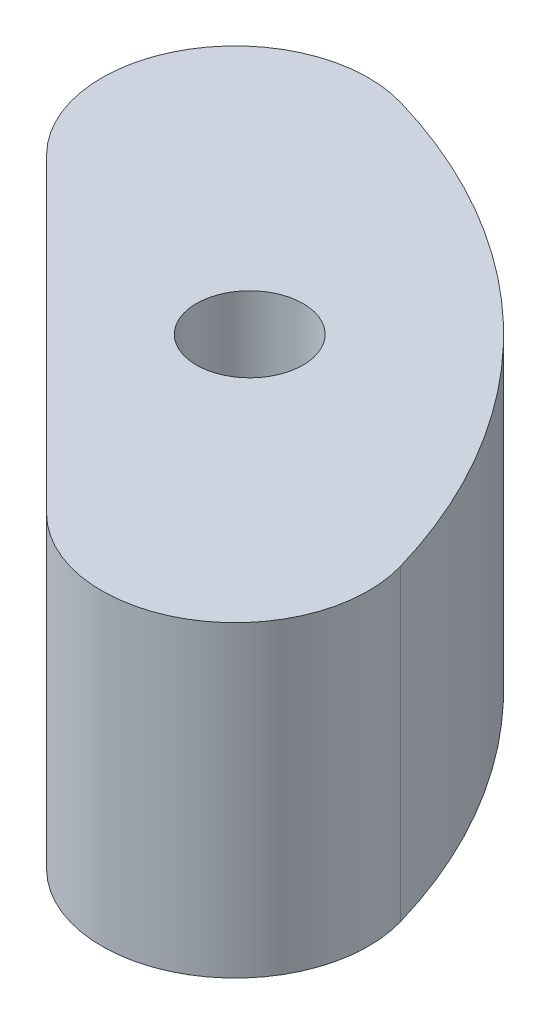
ISO-10303-21;
HEADER;
FILE_DESCRIPTION(('STEP AP214'),'2;1');
FILE_NAME('part.step','',(''),(''),'','','');
FILE_SCHEMA(('AUTOMOTIVE_DESIGN { 1 0 10303 214 1 1 1 1 }'));
ENDSEC;
DATA;
#1=APPLICATION_CONTEXT('core data for automotive mechanical design processes');
#2=APPLICATION_PROTOCOL_DEFINITION('international standard','automotive_design',2000,#1);
#3=PRODUCT_CONTEXT('',#1,'mechanical');
#4=PRODUCT('Part','Part','',(#3));
#5=PRODUCT_RELATED_PRODUCT_CATEGORY('part','',(#4));
#6=PRODUCT_DEFINITION_FORMATION('','',#4);
#7=PRODUCT_DEFINITION_CONTEXT('part definition',#1,'design');
#8=PRODUCT_DEFINITION('design','',#6,#7);
#9=PRODUCT_DEFINITION_SHAPE('','',#8);
#10=(LENGTH_UNIT() NAMED_UNIT(*) SI_UNIT(.MILLI.,.METRE.));
#11=(NAMED_UNIT(*) PLANE_ANGLE_UNIT() SI_UNIT($,.RADIAN.));
#12=(NAMED_UNIT(*) SI_UNIT($,.STERADIAN.) SOLID_ANGLE_UNIT());
#13=UNCERTAINTY_MEASURE_WITH_UNIT(LENGTH_MEASURE(1.E-05),#10,'distance_accuracy_value','');
#14=(GEOMETRIC_REPRESENTATION_CONTEXT(3) GLOBAL_UNCERTAINTY_ASSIGNED_CONTEXT((#13)) GLOBAL_UNIT_ASSIGNED_CONTEXT((#10,
#11,#12)) REPRESENTATION_CONTEXT('',''));
#15=CARTESIAN_POINT('',(0.,0.,0.));
#16=DIRECTION('',(0.,0.,1.));
#17=DIRECTION('',(1.,0.,0.));
#18=AXIS2_PLACEMENT_3D('',#15,#16,#17);
#19=CARTESIAN_POINT('',(0.,9.525,0.));
#20=DIRECTION('',(0.,1.,0.));
#21=DIRECTION('',(0.,0.,1.));
#22=AXIS2_PLACEMENT_3D('',#19,#20,#21);
#23=PLANE('',#22);
#24=DIRECTION('',(0.707106781186548,0.,0.707106781186547));
#25=VECTOR('',#24,1.);
#26=CARTESIAN_POINT('',(-11.3537211967283,9.525,-34.7023871115081));
#27=LINE('',#26,#25);
#28=CARTESIAN_POINT('',(2.05193509485064,9.525,-21.2967308199291));
#29=VERTEX_POINT('',#28);
#30=CARTESIAN_POINT('',(21.2967308199291,9.525,-2.05193509485065));
#31=VERTEX_POINT('',#30);
#32=EDGE_CURVE('E121',#29,#31,#27,.T.);
#33=ORIENTED_EDGE('',*,*,#32,.T.);
#34=CARTESIAN_POINT('',(27.1338972986241,9.525,-7.8891015735456));
#35=DIRECTION('',(0.,1.,0.));
#36=DIRECTION('',(0.,0.,1.));
#37=AXIS2_PLACEMENT_3D('',#34,#35,#36);
#38=CIRCLE('',#37,8.255);
#39=CARTESIAN_POINT('',(35.0606538128289,9.525,-10.1937829321095));
#40=VERTEX_POINT('',#39);
#41=EDGE_CURVE('E11',#31,#40,#38,.T.);
#42=ORIENTED_EDGE('',*,*,#41,.T.);
#43=CARTESIAN_POINT('',(0.,9.525,0.));
#44=DIRECTION('',(0.,1.,0.));
#45=DIRECTION('',(0.,0.,1.));
#46=AXIS2_PLACEMENT_3D('',#43,#44,#45);
#47=CIRCLE('',#46,36.5125);
#48=CARTESIAN_POINT('',(10.1937829321095,9.525,-35.0606538128289));
#49=VERTEX_POINT('',#48);
#50=EDGE_CURVE('E102',#40,#49,#47,.T.);
#51=ORIENTED_EDGE('',*,*,#50,.T.);
#52=CARTESIAN_POINT('',(7.88910157354559,9.525,-27.1338972986241));
#53=DIRECTION('',(0.,1.,0.));
#54=DIRECTION('',(0.,0.,1.));
#55=AXIS2_PLACEMENT_3D('',#52,#53,#54);
#56=CIRCLE('',#55,8.255);
#57=EDGE_CURVE('E52',#49,#29,#56,.T.);
#58=ORIENTED_EDGE('',*,*,#57,.T.);
#59=EDGE_LOOP('',(#33,#42,#51,#58));
#60=FACE_BOUND('',#59,.T.);
#61=CARTESIAN_POINT('',(17.9605122421383,9.525,-17.9605122421383));
#62=DIRECTION('',(0.,1.,0.));
#63=DIRECTION('',(0.,0.,1.));
#64=AXIS2_PLACEMENT_3D('',#61,#62,#63);
#65=CIRCLE('',#64,3.302);
#66=CARTESIAN_POINT('',(17.9605122421383,9.525,-21.2625122421383));
#67=VERTEX_POINT('',#66);
#68=EDGE_CURVE('E110',#67,#67,#65,.T.);
#69=ORIENTED_EDGE('',*,*,#68,.F.);
#70=EDGE_LOOP('',(#69));
#71=FACE_BOUND('',#70,.T.);
#72=ADVANCED_FACE('F43',(#60,#71),#23,.T.);
#73=CARTESIAN_POINT('',(0.,-9.525,0.));
#74=DIRECTION('',(0.,1.,0.));
#75=DIRECTION('',(0.,0.,1.));
#76=AXIS2_PLACEMENT_3D('',#73,#74,#75);
#77=PLANE('',#76);
#78=CARTESIAN_POINT('',(0.,-9.525,0.));
#79=DIRECTION('',(0.,1.,0.));
#80=DIRECTION('',(0.,0.,1.));
#81=AXIS2_PLACEMENT_3D('',#78,#79,#80);
#82=CIRCLE('',#81,36.5125);
#83=CARTESIAN_POINT('',(35.0606538128289,-9.525,-10.1937829321095));
#84=VERTEX_POINT('',#83);
#85=CARTESIAN_POINT('',(10.1937829321095,-9.525,-35.0606538128289));
#86=VERTEX_POINT('',#85);
#87=EDGE_CURVE('E100',#84,#86,#82,.T.);
#88=ORIENTED_EDGE('',*,*,#87,.F.);
#89=CARTESIAN_POINT('',(27.1338972986241,-9.525,-7.8891015735456));
#90=DIRECTION('',(0.,1.,0.));
#91=DIRECTION('',(0.,0.,1.));
#92=AXIS2_PLACEMENT_3D('',#89,#90,#91);
#93=CIRCLE('',#92,8.255);
#94=CARTESIAN_POINT('',(21.2967308199291,-9.525,-2.05193509485065));
#95=VERTEX_POINT('',#94);
#96=EDGE_CURVE('E84',#84,#95,#93,.F.);
#97=ORIENTED_EDGE('',*,*,#96,.T.);
#98=DIRECTION('',(0.707106781186548,0.,0.707106781186547));
#99=VECTOR('',#98,1.);
#100=CARTESIAN_POINT('',(-11.3537211967283,-9.525,-34.7023871115081));
#101=LINE('',#100,#99);
#102=CARTESIAN_POINT('',(2.05193509485064,-9.525,-21.2967308199291));
#103=VERTEX_POINT('',#102);
#104=EDGE_CURVE('E109',#103,#95,#101,.T.);
#105=ORIENTED_EDGE('',*,*,#104,.F.);
#106=CARTESIAN_POINT('',(7.88910157354559,-9.525,-27.1338972986241));
#107=DIRECTION('',(0.,1.,0.));
#108=DIRECTION('',(0.,0.,1.));
#109=AXIS2_PLACEMENT_3D('',#106,#107,#108);
#110=CIRCLE('',#109,8.255);
#111=EDGE_CURVE('E94',#103,#86,#110,.F.);
#112=ORIENTED_EDGE('',*,*,#111,.T.);
#113=EDGE_LOOP('',(#88,#97,#105,#112));
#114=FACE_BOUND('',#113,.T.);
#115=CARTESIAN_POINT('',(17.9605122421383,-9.525,-17.9605122421383));
#116=DIRECTION('',(0.,1.,0.));
#117=DIRECTION('',(0.,0.,1.));
#118=AXIS2_PLACEMENT_3D('',#115,#116,#117);
#119=CIRCLE('',#118,3.302);
#120=CARTESIAN_POINT('',(17.9605122421383,-9.525,-21.2625122421383));
#121=VERTEX_POINT('',#120);
#122=EDGE_CURVE('E118',#121,#121,#119,.T.);
#123=ORIENTED_EDGE('',*,*,#122,.T.);
#124=EDGE_LOOP('',(#123));
#125=FACE_BOUND('',#124,.T.);
#126=ADVANCED_FACE('F106',(#114,#125),#77,.F.);
#127=CARTESIAN_POINT('',(0.,9.525,0.));
#128=DIRECTION('',(0.,-1.,0.));
#129=DIRECTION('',(0.,0.,-1.));
#130=AXIS2_PLACEMENT_3D('',#127,#128,#129);
#131=CYLINDRICAL_SURFACE('',#130,36.5125);
#132=ORIENTED_EDGE('',*,*,#50,.F.);
#133=DIRECTION('',(0.,-1.,0.));
#134=VECTOR('',#133,1.);
#135=CARTESIAN_POINT('',(35.0606538128289,9.525,-10.1937829321095));
#136=LINE('',#135,#134);
#137=EDGE_CURVE('E88',#40,#84,#136,.T.);
#138=ORIENTED_EDGE('',*,*,#137,.T.);
#139=ORIENTED_EDGE('',*,*,#87,.T.);
#140=DIRECTION('',(0.,-1.,0.));
#141=VECTOR('',#140,1.);
#142=CARTESIAN_POINT('',(10.1937829321095,9.525,-35.0606538128289));
#143=LINE('',#142,#141);
#144=EDGE_CURVE('E104',#86,#49,#143,.F.);
#145=ORIENTED_EDGE('',*,*,#144,.T.);
#146=EDGE_LOOP('',(#132,#138,#139,#145));
#147=FACE_BOUND('',#146,.T.);
#148=ADVANCED_FACE('F99',(#147),#131,.T.);
#149=CARTESIAN_POINT('',(-11.3537211967283,9.525,-34.7023871115081));
#150=DIRECTION('',(0.707106781186547,0.,-0.707106781186548));
#151=DIRECTION('',(-0.707106781186548,0.,-0.707106781186547));
#152=AXIS2_PLACEMENT_3D('',#149,#150,#151);
#153=PLANE('',#152);
#154=CARTESIAN_POINT('',(18.7241875651127,-6.249999946,-4.62447834966712));
#155=DIRECTION('',(-0.707106781186547,0.,0.707106781186548));
#156=DIRECTION('',(0.707106781186548,0.,0.707106781186547));
#157=AXIS2_PLACEMENT_3D('',#154,#155,#156);
#158=CIRCLE('',#157,1.950000037);
#159=CARTESIAN_POINT('',(20.1030458145894,-6.249999946,-3.2456201001904));
#160=VERTEX_POINT('',#159);
#161=EDGE_CURVE('E151',#160,#160,#158,.T.);
#162=ORIENTED_EDGE('',*,*,#161,.F.);
#163=EDGE_LOOP('',(#162));
#164=FACE_BOUND('',#163,.T.);
#165=CARTESIAN_POINT('',(4.62447834966712,-6.249999946,-18.7241875651127));
#166=DIRECTION('',(-0.707106781186547,0.,0.707106781186548));
#167=DIRECTION('',(0.707106781186548,0.,0.707106781186547));
#168=AXIS2_PLACEMENT_3D('',#165,#166,#167);
#169=CIRCLE('',#168,1.950000037);
#170=CARTESIAN_POINT('',(6.00333659914384,-6.249999946,-17.3453293156359));
#171=VERTEX_POINT('',#170);
#172=EDGE_CURVE('E159',#171,#171,#169,.T.);
#173=ORIENTED_EDGE('',*,*,#172,.F.);
#174=EDGE_LOOP('',(#173));
#175=FACE_BOUND('',#174,.T.);
#176=CARTESIAN_POINT('',(4.62447834966712,6.249999946,-18.7241875651127));
#177=DIRECTION('',(-0.707106781186547,0.,0.707106781186548));
#178=DIRECTION('',(0.707106781186548,0.,0.707106781186547));
#179=AXIS2_PLACEMENT_3D('',#176,#177,#178);
#180=CIRCLE('',#179,1.950000037);
#181=CARTESIAN_POINT('',(6.00333659914384,6.249999946,-17.3453293156359));
#182=VERTEX_POINT('',#181);
#183=EDGE_CURVE('E143',#182,#182,#180,.T.);
#184=ORIENTED_EDGE('',*,*,#183,.F.);
#185=EDGE_LOOP('',(#184));
#186=FACE_BOUND('',#185,.T.);
#187=CARTESIAN_POINT('',(18.7241875651127,6.249999946,-4.62447834966712));
#188=DIRECTION('',(-0.707106781186547,0.,0.707106781186548));
#189=DIRECTION('',(0.707106781186548,0.,0.707106781186547));
#190=AXIS2_PLACEMENT_3D('',#187,#188,#189);
#191=CIRCLE('',#190,1.950000037);
#192=CARTESIAN_POINT('',(20.1030458145894,6.249999946,-3.24562010019041));
#193=VERTEX_POINT('',#192);
#194=EDGE_CURVE('E139',#193,#193,#191,.T.);
#195=ORIENTED_EDGE('',*,*,#194,.F.);
#196=EDGE_LOOP('',(#195));
#197=FACE_BOUND('',#196,.T.);
#198=ORIENTED_EDGE('',*,*,#104,.T.);
#199=DIRECTION('',(0.,-1.,0.));
#200=VECTOR('',#199,1.);
#201=CARTESIAN_POINT('',(21.2967308199291,9.525,-2.05193509485065));
#202=LINE('',#201,#200);
#203=EDGE_CURVE('E59',#95,#31,#202,.F.);
#204=ORIENTED_EDGE('',*,*,#203,.T.);
#205=ORIENTED_EDGE('',*,*,#32,.F.);
#206=DIRECTION('',(0.,-1.,0.));
#207=VECTOR('',#206,1.);
#208=CARTESIAN_POINT('',(2.05193509485064,9.525,-21.2967308199291));
#209=LINE('',#208,#207);
#210=EDGE_CURVE('E93',#29,#103,#209,.T.);
#211=ORIENTED_EDGE('',*,*,#210,.T.);
#212=EDGE_LOOP('',(#198,#204,#205,#211));
#213=FACE_BOUND('',#212,.T.);
#214=ADVANCED_FACE('F172',(#164,#175,#186,#197,#213),#153,.F.);
#215=CARTESIAN_POINT('',(17.9605122421383,9.525,-17.9605122421383));
#216=DIRECTION('',(0.,-1.,0.));
#217=DIRECTION('',(0.,0.,-1.));
#218=AXIS2_PLACEMENT_3D('',#215,#216,#217);
#219=CYLINDRICAL_SURFACE('',#218,3.302);
#220=CARTESIAN_POINT('',(17.9605122421383,9.525,-21.2625122421383));
#221=CARTESIAN_POINT('',(17.9605122421383,9.3265625,-21.2625122421383));
#222=CARTESIAN_POINT('',(17.9605122421383,9.128125,-21.2625122421383));
#223=CARTESIAN_POINT('',(17.9605122421383,8.73125,-21.2625122421383));
#224=CARTESIAN_POINT('',(17.9605122421383,8.5328125,-21.2625122421383));
#225=CARTESIAN_POINT('',(17.9605122421383,8.1359375,-21.2625122421383));
#226=CARTESIAN_POINT('',(17.9605122421383,7.9375,-21.2625122421383));
#227=CARTESIAN_POINT('',(17.9605122421383,7.540625,-21.2625122421383));
#228=CARTESIAN_POINT('',(17.9605122421383,7.3421875,-21.2625122421383));
#229=CARTESIAN_POINT('',(17.9605122421383,6.9453125,-21.2625122421383));
#230=CARTESIAN_POINT('',(17.9605122421383,6.746875,-21.2625122421383));
#231=CARTESIAN_POINT('',(17.9605122421383,6.35,-21.2625122421383));
#232=CARTESIAN_POINT('',(17.9605122421383,6.1515625,-21.2625122421383));
#233=CARTESIAN_POINT('',(17.9605122421383,5.7546875,-21.2625122421383));
#234=CARTESIAN_POINT('',(17.9605122421383,5.55625,-21.2625122421383));
#235=CARTESIAN_POINT('',(17.9605122421383,5.159375,-21.2625122421383));
#236=CARTESIAN_POINT('',(17.9605122421383,4.9609375,-21.2625122421383));
#237=CARTESIAN_POINT('',(17.9605122421383,4.5640625,-21.2625122421383));
#238=CARTESIAN_POINT('',(17.9605122421383,4.365625,-21.2625122421383));
#239=CARTESIAN_POINT('',(17.9605122421383,3.96875,-21.2625122421383));
#240=CARTESIAN_POINT('',(17.9605122421383,3.7703125,-21.2625122421383));
#241=CARTESIAN_POINT('',(17.9605122421383,3.3734375,-21.2625122421383));
#242=CARTESIAN_POINT('',(17.9605122421383,3.175,-21.2625122421383));
#243=CARTESIAN_POINT('',(17.9605122421383,2.778125,-21.2625122421383));
#244=CARTESIAN_POINT('',(17.9605122421383,2.5796875,-21.2625122421383));
#245=CARTESIAN_POINT('',(17.9605122421383,2.1828125,-21.2625122421383));
#246=CARTESIAN_POINT('',(17.9605122421383,1.984375,-21.2625122421383));
#247=CARTESIAN_POINT('',(17.9605122421383,1.5875,-21.2625122421383));
#248=CARTESIAN_POINT('',(17.9605122421383,1.3890625,-21.2625122421383));
#249=CARTESIAN_POINT('',(17.9605122421383,0.992187500000001,-21.2625122421383));
#250=CARTESIAN_POINT('',(17.9605122421383,0.793750000000001,-21.2625122421383));
#251=CARTESIAN_POINT('',(17.9605122421383,0.396875,-21.2625122421383));
#252=CARTESIAN_POINT('',(17.9605122421383,0.1984375,-21.2625122421383));
#253=CARTESIAN_POINT('',(17.9605122421383,-0.1984375,-21.2625122421383));
#254=CARTESIAN_POINT('',(17.9605122421383,-0.396875,-21.2625122421383));
#255=CARTESIAN_POINT('',(17.9605122421383,-0.793750000000001,-21.2625122421383));
#256=CARTESIAN_POINT('',(17.9605122421383,-0.992187500000001,-21.2625122421383));
#257=CARTESIAN_POINT('',(17.9605122421383,-1.3890625,-21.2625122421383));
#258=CARTESIAN_POINT('',(17.9605122421383,-1.5875,-21.2625122421383));
#259=CARTESIAN_POINT('',(17.9605122421383,-1.984375,-21.2625122421383));
#260=CARTESIAN_POINT('',(17.9605122421383,-2.1828125,-21.2625122421383));
#261=CARTESIAN_POINT('',(17.9605122421383,-2.5796875,-21.2625122421383));
#262=CARTESIAN_POINT('',(17.9605122421383,-2.778125,-21.2625122421383));
#263=CARTESIAN_POINT('',(17.9605122421383,-3.175,-21.2625122421383));
#264=CARTESIAN_POINT('',(17.9605122421383,-3.3734375,-21.2625122421383));
#265=CARTESIAN_POINT('',(17.9605122421383,-3.7703125,-21.2625122421383));
#266=CARTESIAN_POINT('',(17.9605122421383,-3.96875,-21.2625122421383));
#267=CARTESIAN_POINT('',(17.9605122421383,-4.365625,-21.2625122421383));
#268=CARTESIAN_POINT('',(17.9605122421383,-4.5640625,-21.2625122421383));
#269=CARTESIAN_POINT('',(17.9605122421383,-4.9609375,-21.2625122421383));
#270=CARTESIAN_POINT('',(17.9605122421383,-5.159375,-21.2625122421383));
#271=CARTESIAN_POINT('',(17.9605122421383,-5.55625,-21.2625122421383));
#272=CARTESIAN_POINT('',(17.9605122421383,-5.7546875,-21.2625122421383));
#273=CARTESIAN_POINT('',(17.9605122421383,-6.1515625,-21.2625122421383));
#274=CARTESIAN_POINT('',(17.9605122421383,-6.35,-21.2625122421383));
#275=CARTESIAN_POINT('',(17.9605122421383,-6.746875,-21.2625122421383));
#276=CARTESIAN_POINT('',(17.9605122421383,-6.9453125,-21.2625122421383));
#277=CARTESIAN_POINT('',(17.9605122421383,-7.3421875,-21.2625122421383));
#278=CARTESIAN_POINT('',(17.9605122421383,-7.540625,-21.2625122421383));
#279=CARTESIAN_POINT('',(17.9605122421383,-7.9375,-21.2625122421383));
#280=CARTESIAN_POINT('',(17.9605122421383,-8.1359375,-21.2625122421383));
#281=CARTESIAN_POINT('',(17.9605122421383,-8.5328125,-21.2625122421383));
#282=CARTESIAN_POINT('',(17.9605122421383,-8.73125,-21.2625122421383));
#283=CARTESIAN_POINT('',(17.9605122421383,-9.128125,-21.2625122421383));
#284=CARTESIAN_POINT('',(17.9605122421383,-9.3265625,-21.2625122421383));
#285=CARTESIAN_POINT('',(17.9605122421383,-9.525,-21.2625122421383));
#286=B_SPLINE_CURVE_WITH_KNOTS('',3,(#220,#221,#222,#223,#224,#225,#226,#227,#228,#229,#230,
#231,#232,#233,#234,#235,#236,#237,#238,#239,#240,#241,#242,#243,#244,#245,#246,#247,#248,#249,
#250,#251,#252,#253,#254,#255,#256,#257,#258,#259,#260,#261,#262,#263,#264,#265,#266,#267,#268,
#269,#270,#271,#272,#273,#274,#275,#276,#277,#278,#279,#280,#281,#282,#283,#284,#285),
.UNSPECIFIED.,.F.,.F.,(4,2,2,2,2,2,2,2,2,2,2,2,2,2,2,2,2,2,2,2,2,2,2,2,2,2,2,2,2,2,2,2,4),(0.,
0.5953125,1.190625,1.7859375,2.38125,2.9765625,3.571875,4.1671875,4.7625,5.3578125,5.953125,
6.5484375,7.14375,7.7390625,8.334375,8.9296875,9.525,10.1203125,10.715625,11.3109375,11.90625,
12.5015625,13.096875,13.6921875,14.2875,14.8828125,15.478125,16.0734375,16.66875,17.2640625,
17.859375,18.4546875,19.05),.UNSPECIFIED.);
#287=EDGE_CURVE('BSEAM175',#67,#121,#286,.T.);
#288=ORIENTED_EDGE('',*,*,#68,.T.);
#289=ORIENTED_EDGE('',*,*,#122,.F.);
#290=ORIENTED_EDGE('',*,*,#287,.T.);
#291=ORIENTED_EDGE('',*,*,#287,.F.);
#292=EDGE_LOOP('',(#288,#290,#289,#291));
#293=FACE_BOUND('',#292,.T.);
#294=ADVANCED_FACE('F175',(#293),#219,.F.);
#295=CARTESIAN_POINT('',(22.8254069553916,6.249999946,-8.72569773994607));
#296=DIRECTION('',(-0.707106781186547,0.,0.707106781186548));
#297=DIRECTION('',(0.707106781186548,0.,0.707106781186547));
#298=AXIS2_PLACEMENT_3D('',#295,#296,#297);
#299=CYLINDRICAL_SURFACE('',#298,1.950000037);
#300=CARTESIAN_POINT('',(22.8254069553916,6.249999946,-8.72569773994607));
#301=DIRECTION('',(-0.707106781186547,0.,0.707106781186548));
#302=DIRECTION('',(0.707106781186548,0.,0.707106781186547));
#303=AXIS2_PLACEMENT_3D('',#300,#301,#302);
#304=CIRCLE('',#303,1.950000037);
#305=CARTESIAN_POINT('',(24.2042652048683,6.249999946,-7.34683949046935));
#306=VERTEX_POINT('',#305);
#307=EDGE_CURVE('E137',#306,#306,#304,.T.);
#308=ORIENTED_EDGE('',*,*,#307,.F.);
#309=EDGE_LOOP('',(#308));
#310=FACE_BOUND('',#309,.T.);
#311=ORIENTED_EDGE('',*,*,#194,.T.);
#312=EDGE_LOOP('',(#311));
#313=FACE_BOUND('',#312,.T.);
#314=ADVANCED_FACE('F206',(#310,#313),#299,.F.);
#315=CARTESIAN_POINT('',(22.8254069553916,6.249999946,-8.72569773994607));
#316=DIRECTION('',(-0.707106781186547,0.,0.707106781186548));
#317=DIRECTION('',(0.707106781186548,0.,0.707106781186547));
#318=AXIS2_PLACEMENT_3D('',#315,#316,#317);
#319=PLANE('',#318);
#320=ORIENTED_EDGE('',*,*,#307,.T.);
#321=EDGE_LOOP('',(#320));
#322=FACE_BOUND('',#321,.T.);
#323=ADVANCED_FACE('F212',(#322),#319,.T.);
#324=CARTESIAN_POINT('',(8.72569773994607,6.249999946,-22.8254069553916));
#325=DIRECTION('',(-0.707106781186547,0.,0.707106781186548));
#326=DIRECTION('',(0.707106781186548,0.,0.707106781186547));
#327=AXIS2_PLACEMENT_3D('',#324,#325,#326);
#328=CYLINDRICAL_SURFACE('',#327,1.950000037);
#329=CARTESIAN_POINT('',(8.72569773994607,6.249999946,-22.8254069553916));
#330=DIRECTION('',(-0.707106781186547,0.,0.707106781186548));
#331=DIRECTION('',(0.707106781186548,0.,0.707106781186547));
#332=AXIS2_PLACEMENT_3D('',#329,#330,#331);
#333=CIRCLE('',#332,1.950000037);
#334=CARTESIAN_POINT('',(10.1045559894228,6.249999946,-21.4465487059149));
#335=VERTEX_POINT('',#334);
#336=EDGE_CURVE('E162',#335,#335,#333,.T.);
#337=ORIENTED_EDGE('',*,*,#336,.F.);
#338=EDGE_LOOP('',(#337));
#339=FACE_BOUND('',#338,.T.);
#340=ORIENTED_EDGE('',*,*,#183,.T.);
#341=EDGE_LOOP('',(#340));
#342=FACE_BOUND('',#341,.T.);
#343=ADVANCED_FACE('F170',(#339,#342),#328,.F.);
#344=CARTESIAN_POINT('',(8.72569773994607,6.249999946,-22.8254069553916));
#345=DIRECTION('',(-0.707106781186547,0.,0.707106781186548));
#346=DIRECTION('',(0.707106781186548,0.,0.707106781186547));
#347=AXIS2_PLACEMENT_3D('',#344,#345,#346);
#348=PLANE('',#347);
#349=ORIENTED_EDGE('',*,*,#336,.T.);
#350=EDGE_LOOP('',(#349));
#351=FACE_BOUND('',#350,.T.);
#352=ADVANCED_FACE('F224',(#351),#348,.T.);
#353=CARTESIAN_POINT('',(8.72569773994607,-6.249999946,-22.8254069553916));
#354=DIRECTION('',(-0.707106781186547,0.,0.707106781186548));
#355=DIRECTION('',(0.707106781186548,0.,0.707106781186547));
#356=AXIS2_PLACEMENT_3D('',#353,#354,#355);
#357=CYLINDRICAL_SURFACE('',#356,1.950000037);
#358=CARTESIAN_POINT('',(8.72569773994607,-6.249999946,-22.8254069553916));
#359=DIRECTION('',(-0.707106781186547,0.,0.707106781186548));
#360=DIRECTION('',(0.707106781186548,0.,0.707106781186547));
#361=AXIS2_PLACEMENT_3D('',#358,#359,#360);
#362=CIRCLE('',#361,1.950000037);
#363=CARTESIAN_POINT('',(10.1045559894228,-6.249999946,-21.4465487059149));
#364=VERTEX_POINT('',#363);
#365=EDGE_CURVE('E155',#364,#364,#362,.T.);
#366=ORIENTED_EDGE('',*,*,#365,.F.);
#367=EDGE_LOOP('',(#366));
#368=FACE_BOUND('',#367,.T.);
#369=ORIENTED_EDGE('',*,*,#172,.T.);
#370=EDGE_LOOP('',(#369));
#371=FACE_BOUND('',#370,.T.);
#372=ADVANCED_FACE('F231',(#368,#371),#357,.F.);
#373=CARTESIAN_POINT('',(8.72569773994607,-6.249999946,-22.8254069553916));
#374=DIRECTION('',(-0.707106781186547,0.,0.707106781186548));
#375=DIRECTION('',(0.707106781186548,0.,0.707106781186547));
#376=AXIS2_PLACEMENT_3D('',#373,#374,#375);
#377=PLANE('',#376);
#378=ORIENTED_EDGE('',*,*,#365,.T.);
#379=EDGE_LOOP('',(#378));
#380=FACE_BOUND('',#379,.T.);
#381=ADVANCED_FACE('F238',(#380),#377,.T.);
#382=CARTESIAN_POINT('',(22.8254069553916,-6.249999946,-8.72569773994607));
#383=DIRECTION('',(-0.707106781186547,0.,0.707106781186548));
#384=DIRECTION('',(0.707106781186548,0.,0.707106781186547));
#385=AXIS2_PLACEMENT_3D('',#382,#383,#384);
#386=CYLINDRICAL_SURFACE('',#385,1.950000037);
#387=CARTESIAN_POINT('',(22.8254069553916,-6.249999946,-8.72569773994607));
#388=DIRECTION('',(-0.707106781186547,0.,0.707106781186548));
#389=DIRECTION('',(0.707106781186548,0.,0.707106781186547));
#390=AXIS2_PLACEMENT_3D('',#387,#388,#389);
#391=CIRCLE('',#390,1.950000037);
#392=CARTESIAN_POINT('',(24.2042652048683,-6.249999946,-7.34683949046935));
#393=VERTEX_POINT('',#392);
#394=EDGE_CURVE('E147',#393,#393,#391,.T.);
#395=ORIENTED_EDGE('',*,*,#394,.F.);
#396=EDGE_LOOP('',(#395));
#397=FACE_BOUND('',#396,.T.);
#398=ORIENTED_EDGE('',*,*,#161,.T.);
#399=EDGE_LOOP('',(#398));
#400=FACE_BOUND('',#399,.T.);
#401=ADVANCED_FACE('F245',(#397,#400),#386,.F.);
#402=CARTESIAN_POINT('',(22.8254069553916,-6.249999946,-8.72569773994607));
#403=DIRECTION('',(-0.707106781186547,0.,0.707106781186548));
#404=DIRECTION('',(0.707106781186548,0.,0.707106781186547));
#405=AXIS2_PLACEMENT_3D('',#402,#403,#404);
#406=PLANE('',#405);
#407=ORIENTED_EDGE('',*,*,#394,.T.);
#408=EDGE_LOOP('',(#407));
#409=FACE_BOUND('',#408,.T.);
#410=ADVANCED_FACE('F184',(#409),#406,.T.);
#411=CARTESIAN_POINT('',(27.1338972986241,9.525,-7.8891015735456));
#412=DIRECTION('',(0.,-1.,0.));
#413=DIRECTION('',(0.,0.,-1.));
#414=AXIS2_PLACEMENT_3D('',#411,#412,#413);
#415=CYLINDRICAL_SURFACE('',#414,8.255);
#416=ORIENTED_EDGE('',*,*,#41,.F.);
#417=ORIENTED_EDGE('',*,*,#203,.F.);
#418=ORIENTED_EDGE('',*,*,#96,.F.);
#419=ORIENTED_EDGE('',*,*,#137,.F.);
#420=EDGE_LOOP('',(#416,#417,#418,#419));
#421=FACE_BOUND('',#420,.T.);
#422=ADVANCED_FACE('F87',(#421),#415,.T.);
#423=CARTESIAN_POINT('',(7.88910157354559,9.525,-27.1338972986241));
#424=DIRECTION('',(0.,-1.,0.));
#425=DIRECTION('',(0.,0.,-1.));
#426=AXIS2_PLACEMENT_3D('',#423,#424,#425);
#427=CYLINDRICAL_SURFACE('',#426,8.255);
#428=ORIENTED_EDGE('',*,*,#57,.F.);
#429=ORIENTED_EDGE('',*,*,#144,.F.);
#430=ORIENTED_EDGE('',*,*,#111,.F.);
#431=ORIENTED_EDGE('',*,*,#210,.F.);
#432=EDGE_LOOP('',(#428,#429,#430,#431));
#433=FACE_BOUND('',#432,.T.);
#434=ADVANCED_FACE('F45',(#433),#427,.T.);
#435=CLOSED_SHELL('',(#72,#126,#148,#214,#294,#314,#323,#343,#352,#372,#381,#401,#410,#422,#434));
#436=MANIFOLD_SOLID_BREP('B2',#435);
#437=ADVANCED_BREP_SHAPE_REPRESENTATION('',(#18,#436),#14);
#438=SHAPE_DEFINITION_REPRESENTATION(#9,#437);
ENDSEC;
END-ISO-10303-21;
